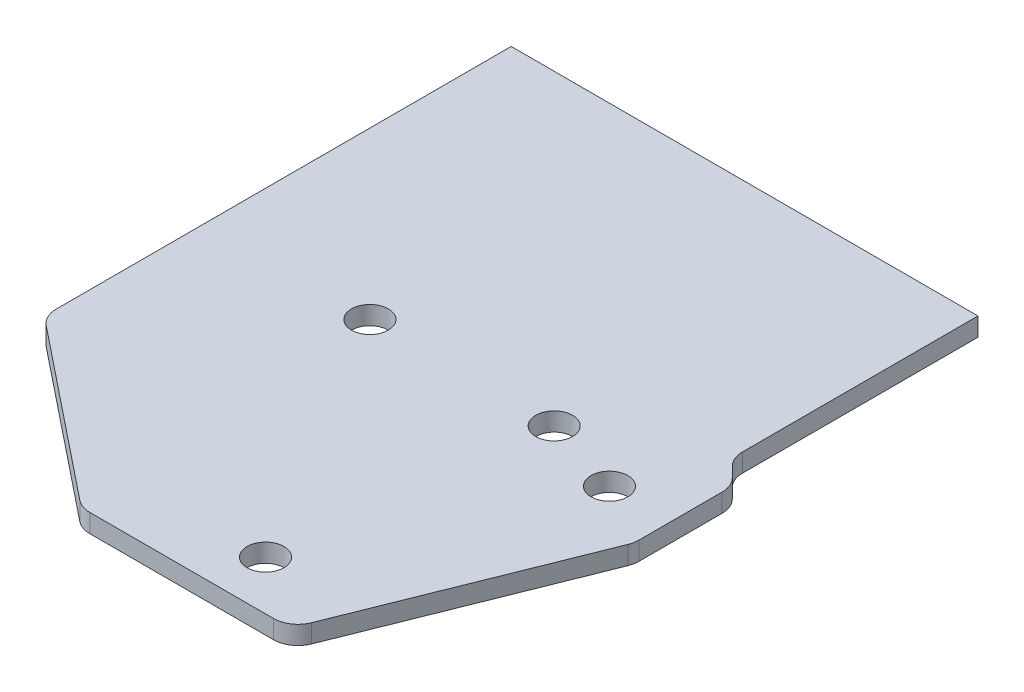
ISO-10303-21;
HEADER;
FILE_DESCRIPTION(('STEP AP214'),'2;1');
FILE_NAME('part.step','',(''),(''),'','','');
FILE_SCHEMA(('AUTOMOTIVE_DESIGN { 1 0 10303 214 1 1 1 1 }'));
ENDSEC;
DATA;
#1=APPLICATION_CONTEXT('core data for automotive mechanical design processes');
#2=APPLICATION_PROTOCOL_DEFINITION('international standard','automotive_design',2000,#1);
#3=PRODUCT_CONTEXT('',#1,'mechanical');
#4=PRODUCT('Part','Part','',(#3));
#5=PRODUCT_RELATED_PRODUCT_CATEGORY('part','',(#4));
#6=PRODUCT_DEFINITION_FORMATION('','',#4);
#7=PRODUCT_DEFINITION_CONTEXT('part definition',#1,'design');
#8=PRODUCT_DEFINITION('design','',#6,#7);
#9=PRODUCT_DEFINITION_SHAPE('','',#8);
#10=(LENGTH_UNIT() NAMED_UNIT(*) SI_UNIT(.MILLI.,.METRE.));
#11=(NAMED_UNIT(*) PLANE_ANGLE_UNIT() SI_UNIT($,.RADIAN.));
#12=(NAMED_UNIT(*) SI_UNIT($,.STERADIAN.) SOLID_ANGLE_UNIT());
#13=UNCERTAINTY_MEASURE_WITH_UNIT(LENGTH_MEASURE(1.E-05),#10,'distance_accuracy_value','');
#14=(GEOMETRIC_REPRESENTATION_CONTEXT(3) GLOBAL_UNCERTAINTY_ASSIGNED_CONTEXT((#13)) GLOBAL_UNIT_ASSIGNED_CONTEXT((#10,
#11,#12)) REPRESENTATION_CONTEXT('',''));
#15=CARTESIAN_POINT('',(0.,0.,0.));
#16=DIRECTION('',(0.,0.,1.));
#17=DIRECTION('',(1.,0.,0.));
#18=AXIS2_PLACEMENT_3D('',#15,#16,#17);
#19=CARTESIAN_POINT('',(19.,1.5,-2.17157287525381));
#20=DIRECTION('',(0.,-1.,0.));
#21=DIRECTION('',(0.,0.,-1.));
#22=AXIS2_PLACEMENT_3D('',#19,#20,#21);
#23=CYLINDRICAL_SURFACE('',#22,2.);
#24=CARTESIAN_POINT('',(19.,0.,-2.17157287525381));
#25=DIRECTION('',(0.,1.,0.));
#26=DIRECTION('',(0.,0.,1.));
#27=AXIS2_PLACEMENT_3D('',#24,#25,#26);
#28=CIRCLE('',#27,2.);
#29=CARTESIAN_POINT('',(20.4142135623731,0.,-3.5857864376269));
#30=VERTEX_POINT('',#29);
#31=CARTESIAN_POINT('',(21.,0.,-2.1715728752538));
#32=VERTEX_POINT('',#31);
#33=EDGE_CURVE('E176',#30,#32,#28,.F.);
#34=ORIENTED_EDGE('',*,*,#33,.F.);
#35=DIRECTION('',(0.,-1.,0.));
#36=VECTOR('',#35,1.);
#37=CARTESIAN_POINT('',(20.4142135623731,1.5,-3.5857864376269));
#38=LINE('',#37,#36);
#39=CARTESIAN_POINT('',(20.4142135623731,1.5,-3.5857864376269));
#40=VERTEX_POINT('',#39);
#41=EDGE_CURVE('E11',#40,#30,#38,.T.);
#42=ORIENTED_EDGE('',*,*,#41,.F.);
#43=CARTESIAN_POINT('',(19.,1.5,-2.17157287525381));
#44=DIRECTION('',(0.,1.,0.));
#45=DIRECTION('',(0.,0.,1.));
#46=AXIS2_PLACEMENT_3D('',#43,#44,#45);
#47=CIRCLE('',#46,2.);
#48=CARTESIAN_POINT('',(21.,1.5,-2.1715728752538));
#49=VERTEX_POINT('',#48);
#50=EDGE_CURVE('E223',#40,#49,#47,.F.);
#51=ORIENTED_EDGE('',*,*,#50,.T.);
#52=DIRECTION('',(0.,-1.,0.));
#53=VECTOR('',#52,1.);
#54=CARTESIAN_POINT('',(21.,1.5,-2.1715728752538));
#55=LINE('',#54,#53);
#56=EDGE_CURVE('E50',#49,#32,#55,.T.);
#57=ORIENTED_EDGE('',*,*,#56,.T.);
#58=EDGE_LOOP('',(#34,#42,#51,#57));
#59=FACE_BOUND('',#58,.T.);
#60=ADVANCED_FACE('F34',(#59),#23,.T.);
#61=CARTESIAN_POINT('',(11.9999999999999,1.5,-12.));
#62=DIRECTION('',(-0.707106781186545,0.,0.70710678118655));
#63=DIRECTION('',(0.70710678118655,0.,0.707106781186545));
#64=AXIS2_PLACEMENT_3D('',#61,#62,#63);
#65=PLANE('',#64);
#66=DIRECTION('',(-0.70710678118655,0.,-0.707106781186545));
#67=VECTOR('',#66,1.);
#68=CARTESIAN_POINT('',(11.9999999999999,0.,-12.));
#69=LINE('',#68,#67);
#70=CARTESIAN_POINT('',(19.5857864376269,0.,-4.41421356237308));
#71=VERTEX_POINT('',#70);
#72=EDGE_CURVE('E178',#30,#71,#69,.T.);
#73=ORIENTED_EDGE('',*,*,#72,.T.);
#74=DIRECTION('',(0.,-1.,0.));
#75=VECTOR('',#74,1.);
#76=CARTESIAN_POINT('',(19.5857864376269,1.5,-4.41421356237308));
#77=LINE('',#76,#75);
#78=CARTESIAN_POINT('',(19.5857864376269,1.5,-4.41421356237308));
#79=VERTEX_POINT('',#78);
#80=EDGE_CURVE('E42',#79,#71,#77,.T.);
#81=ORIENTED_EDGE('',*,*,#80,.F.);
#82=DIRECTION('',(-0.70710678118655,0.,-0.707106781186545));
#83=VECTOR('',#82,1.);
#84=CARTESIAN_POINT('',(11.9999999999999,1.5,-12.));
#85=LINE('',#84,#83);
#86=EDGE_CURVE('E269',#40,#79,#85,.T.);
#87=ORIENTED_EDGE('',*,*,#86,.F.);
#88=ORIENTED_EDGE('',*,*,#41,.T.);
#89=EDGE_LOOP('',(#73,#81,#87,#88));
#90=FACE_BOUND('',#89,.T.);
#91=ADVANCED_FACE('F254',(#90),#65,.F.);
#92=CARTESIAN_POINT('',(21.,1.5,-5.82842712474618));
#93=DIRECTION('',(0.,-1.,0.));
#94=DIRECTION('',(0.,0.,-1.));
#95=AXIS2_PLACEMENT_3D('',#92,#93,#94);
#96=CYLINDRICAL_SURFACE('',#95,1.99999999999999);
#97=CARTESIAN_POINT('',(21.,0.,-5.82842712474618));
#98=DIRECTION('',(0.,1.,0.));
#99=DIRECTION('',(0.,0.,1.));
#100=AXIS2_PLACEMENT_3D('',#97,#98,#99);
#101=CIRCLE('',#100,1.99999999999999);
#102=CARTESIAN_POINT('',(19.,0.,-5.82842712474618));
#103=VERTEX_POINT('',#102);
#104=EDGE_CURVE('E181',#103,#71,#101,.T.);
#105=ORIENTED_EDGE('',*,*,#104,.F.);
#106=DIRECTION('',(0.,-1.,0.));
#107=VECTOR('',#106,1.);
#108=CARTESIAN_POINT('',(19.,1.5,-5.82842712474618));
#109=LINE('',#108,#107);
#110=CARTESIAN_POINT('',(19.,1.5,-5.82842712474618));
#111=VERTEX_POINT('',#110);
#112=EDGE_CURVE('E244',#111,#103,#109,.T.);
#113=ORIENTED_EDGE('',*,*,#112,.F.);
#114=CARTESIAN_POINT('',(21.,1.5,-5.82842712474618));
#115=DIRECTION('',(0.,1.,0.));
#116=DIRECTION('',(0.,0.,1.));
#117=AXIS2_PLACEMENT_3D('',#114,#115,#116);
#118=CIRCLE('',#117,1.99999999999999);
#119=EDGE_CURVE('E251',#111,#79,#118,.T.);
#120=ORIENTED_EDGE('',*,*,#119,.T.);
#121=ORIENTED_EDGE('',*,*,#80,.T.);
#122=EDGE_LOOP('',(#105,#113,#120,#121));
#123=FACE_BOUND('',#122,.T.);
#124=ADVANCED_FACE('F249',(#123),#96,.F.);
#125=CARTESIAN_POINT('',(19.,1.5,0.));
#126=DIRECTION('',(-1.,0.,0.));
#127=DIRECTION('',(0.,0.,1.));
#128=AXIS2_PLACEMENT_3D('',#125,#126,#127);
#129=PLANE('',#128);
#130=DIRECTION('',(0.,0.,-1.));
#131=VECTOR('',#130,1.);
#132=CARTESIAN_POINT('',(19.,0.,0.));
#133=LINE('',#132,#131);
#134=CARTESIAN_POINT('',(19.,0.,-25.));
#135=VERTEX_POINT('',#134);
#136=EDGE_CURVE('E184',#103,#135,#133,.T.);
#137=ORIENTED_EDGE('',*,*,#136,.T.);
#138=DIRECTION('',(0.,-1.,0.));
#139=VECTOR('',#138,1.);
#140=CARTESIAN_POINT('',(19.,1.5,-25.));
#141=LINE('',#140,#139);
#142=CARTESIAN_POINT('',(19.,1.5,-25.));
#143=VERTEX_POINT('',#142);
#144=EDGE_CURVE('E242',#143,#135,#141,.T.);
#145=ORIENTED_EDGE('',*,*,#144,.F.);
#146=DIRECTION('',(0.,0.,-1.));
#147=VECTOR('',#146,1.);
#148=CARTESIAN_POINT('',(19.,1.5,0.));
#149=LINE('',#148,#147);
#150=EDGE_CURVE('E265',#111,#143,#149,.T.);
#151=ORIENTED_EDGE('',*,*,#150,.F.);
#152=ORIENTED_EDGE('',*,*,#112,.T.);
#153=EDGE_LOOP('',(#137,#145,#151,#152));
#154=FACE_BOUND('',#153,.T.);
#155=ADVANCED_FACE('F262',(#154),#129,.F.);
#156=CARTESIAN_POINT('',(0.,1.5,-25.));
#157=DIRECTION('',(0.,0.,-1.));
#158=DIRECTION('',(-1.,0.,0.));
#159=AXIS2_PLACEMENT_3D('',#156,#157,#158);
#160=PLANE('',#159);
#161=DIRECTION('',(1.,0.,0.));
#162=VECTOR('',#161,1.);
#163=CARTESIAN_POINT('',(0.,0.,-25.));
#164=LINE('',#163,#162);
#165=CARTESIAN_POINT('',(-19.,0.,-25.));
#166=VERTEX_POINT('',#165);
#167=EDGE_CURVE('E187',#166,#135,#164,.T.);
#168=ORIENTED_EDGE('',*,*,#167,.F.);
#169=DIRECTION('',(0.,-1.,0.));
#170=VECTOR('',#169,1.);
#171=CARTESIAN_POINT('',(-19.,1.5,-25.));
#172=LINE('',#171,#170);
#173=CARTESIAN_POINT('',(-19.,1.5,-25.));
#174=VERTEX_POINT('',#173);
#175=EDGE_CURVE('E240',#174,#166,#172,.T.);
#176=ORIENTED_EDGE('',*,*,#175,.F.);
#177=DIRECTION('',(1.,0.,0.));
#178=VECTOR('',#177,1.);
#179=CARTESIAN_POINT('',(0.,1.5,-25.));
#180=LINE('',#179,#178);
#181=EDGE_CURVE('E267',#174,#143,#180,.T.);
#182=ORIENTED_EDGE('',*,*,#181,.T.);
#183=ORIENTED_EDGE('',*,*,#144,.T.);
#184=EDGE_LOOP('',(#168,#176,#182,#183));
#185=FACE_BOUND('',#184,.T.);
#186=ADVANCED_FACE('F316',(#185),#160,.T.);
#187=CARTESIAN_POINT('',(-19.,1.5,0.));
#188=DIRECTION('',(-1.,0.,0.));
#189=DIRECTION('',(0.,0.,1.));
#190=AXIS2_PLACEMENT_3D('',#187,#188,#189);
#191=PLANE('',#190);
#192=DIRECTION('',(0.,0.,-1.));
#193=VECTOR('',#192,1.);
#194=CARTESIAN_POINT('',(-19.,0.,0.));
#195=LINE('',#194,#193);
#196=CARTESIAN_POINT('',(-19.,0.,12.0387503050268));
#197=VERTEX_POINT('',#196);
#198=EDGE_CURVE('E190',#197,#166,#195,.T.);
#199=ORIENTED_EDGE('',*,*,#198,.F.);
#200=DIRECTION('',(0.,-1.,0.));
#201=VECTOR('',#200,1.);
#202=CARTESIAN_POINT('',(-19.,1.5,12.0387503050268));
#203=LINE('',#202,#201);
#204=CARTESIAN_POINT('',(-19.,1.5,12.0387503050268));
#205=VERTEX_POINT('',#204);
#206=EDGE_CURVE('E238',#205,#197,#203,.T.);
#207=ORIENTED_EDGE('',*,*,#206,.F.);
#208=DIRECTION('',(0.,0.,-1.));
#209=VECTOR('',#208,1.);
#210=CARTESIAN_POINT('',(-19.,1.5,0.));
#211=LINE('',#210,#209);
#212=EDGE_CURVE('E275',#205,#174,#211,.T.);
#213=ORIENTED_EDGE('',*,*,#212,.T.);
#214=ORIENTED_EDGE('',*,*,#175,.T.);
#215=EDGE_LOOP('',(#199,#207,#213,#214));
#216=FACE_BOUND('',#215,.T.);
#217=ADVANCED_FACE('F319',(#216),#191,.T.);
#218=CARTESIAN_POINT('',(-17.,1.5,12.0387503050269));
#219=DIRECTION('',(0.,-1.,0.));
#220=DIRECTION('',(0.,0.,-1.));
#221=AXIS2_PLACEMENT_3D('',#218,#219,#220);
#222=CYLINDRICAL_SURFACE('',#221,2.);
#223=CARTESIAN_POINT('',(-17.,0.,12.0387503050269));
#224=DIRECTION('',(0.,1.,0.));
#225=DIRECTION('',(0.,0.,1.));
#226=AXIS2_PLACEMENT_3D('',#223,#224,#225);
#227=CIRCLE('',#226,2.);
#228=CARTESIAN_POINT('',(-18.2493900951088,0.,13.6004879239129));
#229=VERTEX_POINT('',#228);
#230=EDGE_CURVE('E193',#197,#229,#227,.T.);
#231=ORIENTED_EDGE('',*,*,#230,.T.);
#232=DIRECTION('',(0.,-1.,0.));
#233=VECTOR('',#232,1.);
#234=CARTESIAN_POINT('',(-18.2493900951088,1.5,13.6004879239129));
#235=LINE('',#234,#233);
#236=CARTESIAN_POINT('',(-18.2493900951088,1.5,13.6004879239129));
#237=VERTEX_POINT('',#236);
#238=EDGE_CURVE('E235',#237,#229,#235,.T.);
#239=ORIENTED_EDGE('',*,*,#238,.F.);
#240=CARTESIAN_POINT('',(-17.,1.5,12.0387503050269));
#241=DIRECTION('',(0.,1.,0.));
#242=DIRECTION('',(0.,0.,1.));
#243=AXIS2_PLACEMENT_3D('',#240,#241,#242);
#244=CIRCLE('',#243,2.);
#245=EDGE_CURVE('E278',#205,#237,#244,.T.);
#246=ORIENTED_EDGE('',*,*,#245,.F.);
#247=ORIENTED_EDGE('',*,*,#206,.T.);
#248=EDGE_LOOP('',(#231,#239,#246,#247));
#249=FACE_BOUND('',#248,.T.);
#250=ADVANCED_FACE('F323',(#249),#222,.T.);
#251=CARTESIAN_POINT('',(-13.7560975609756,1.5,17.1951219512195));
#252=DIRECTION('',(0.624695047554425,0.,-0.78086880944303));
#253=DIRECTION('',(-0.78086880944303,0.,-0.624695047554425));
#254=AXIS2_PLACEMENT_3D('',#251,#252,#253);
#255=PLANE('',#254);
#256=DIRECTION('',(0.78086880944303,0.,0.624695047554425));
#257=VECTOR('',#256,1.);
#258=CARTESIAN_POINT('',(-13.7560975609756,0.,17.1951219512195));
#259=LINE('',#258,#257);
#260=CARTESIAN_POINT('',(-4.54782797639243,0.,24.5617376188861));
#261=VERTEX_POINT('',#260);
#262=EDGE_CURVE('E195',#229,#261,#259,.T.);
#263=ORIENTED_EDGE('',*,*,#262,.T.);
#264=DIRECTION('',(0.,-1.,0.));
#265=VECTOR('',#264,1.);
#266=CARTESIAN_POINT('',(-4.54782797639243,1.5,24.5617376188861));
#267=LINE('',#266,#265);
#268=CARTESIAN_POINT('',(-4.54782797639243,1.5,24.5617376188861));
#269=VERTEX_POINT('',#268);
#270=EDGE_CURVE('E232',#269,#261,#267,.T.);
#271=ORIENTED_EDGE('',*,*,#270,.F.);
#272=DIRECTION('',(0.78086880944303,0.,0.624695047554425));
#273=VECTOR('',#272,1.);
#274=CARTESIAN_POINT('',(-13.7560975609756,1.5,17.1951219512195));
#275=LINE('',#274,#273);
#276=EDGE_CURVE('E280',#237,#269,#275,.T.);
#277=ORIENTED_EDGE('',*,*,#276,.F.);
#278=ORIENTED_EDGE('',*,*,#238,.T.);
#279=EDGE_LOOP('',(#263,#271,#277,#278));
#280=FACE_BOUND('',#279,.T.);
#281=ADVANCED_FACE('F327',(#280),#255,.F.);
#282=CARTESIAN_POINT('',(-3.29843788128358,1.5,23.));
#283=DIRECTION('',(0.,-1.,0.));
#284=DIRECTION('',(0.,0.,-1.));
#285=AXIS2_PLACEMENT_3D('',#282,#283,#284);
#286=CYLINDRICAL_SURFACE('',#285,2.);
#287=CARTESIAN_POINT('',(-3.29843788128358,0.,23.));
#288=DIRECTION('',(0.,1.,0.));
#289=DIRECTION('',(0.,0.,1.));
#290=AXIS2_PLACEMENT_3D('',#287,#288,#289);
#291=CIRCLE('',#290,2.);
#292=CARTESIAN_POINT('',(-3.29843788128357,0.,25.));
#293=VERTEX_POINT('',#292);
#294=EDGE_CURVE('E197',#261,#293,#291,.T.);
#295=ORIENTED_EDGE('',*,*,#294,.T.);
#296=DIRECTION('',(0.,-1.,0.));
#297=VECTOR('',#296,1.);
#298=CARTESIAN_POINT('',(-3.29843788128357,1.5,25.));
#299=LINE('',#298,#297);
#300=CARTESIAN_POINT('',(-3.29843788128357,1.5,25.));
#301=VERTEX_POINT('',#300);
#302=EDGE_CURVE('E229',#301,#293,#299,.T.);
#303=ORIENTED_EDGE('',*,*,#302,.F.);
#304=CARTESIAN_POINT('',(-3.29843788128358,1.5,23.));
#305=DIRECTION('',(0.,1.,0.));
#306=DIRECTION('',(0.,0.,1.));
#307=AXIS2_PLACEMENT_3D('',#304,#305,#306);
#308=CIRCLE('',#307,2.);
#309=EDGE_CURVE('E282',#269,#301,#308,.T.);
#310=ORIENTED_EDGE('',*,*,#309,.F.);
#311=ORIENTED_EDGE('',*,*,#270,.T.);
#312=EDGE_LOOP('',(#295,#303,#310,#311));
#313=FACE_BOUND('',#312,.T.);
#314=ADVANCED_FACE('F331',(#313),#286,.T.);
#315=CARTESIAN_POINT('',(0.,1.5,25.));
#316=DIRECTION('',(0.,0.,-1.));
#317=DIRECTION('',(-1.,0.,0.));
#318=AXIS2_PLACEMENT_3D('',#315,#316,#317);
#319=PLANE('',#318);
#320=DIRECTION('',(1.,0.,0.));
#321=VECTOR('',#320,1.);
#322=CARTESIAN_POINT('',(0.,0.,25.));
#323=LINE('',#322,#321);
#324=CARTESIAN_POINT('',(11.6459340771462,0.,25.));
#325=VERTEX_POINT('',#324);
#326=EDGE_CURVE('E199',#293,#325,#323,.T.);
#327=ORIENTED_EDGE('',*,*,#326,.T.);
#328=DIRECTION('',(0.,-1.,0.));
#329=VECTOR('',#328,1.);
#330=CARTESIAN_POINT('',(11.6459340771462,1.5,25.));
#331=LINE('',#330,#329);
#332=CARTESIAN_POINT('',(11.6459340771462,1.5,25.));
#333=VERTEX_POINT('',#332);
#334=EDGE_CURVE('E227',#333,#325,#331,.T.);
#335=ORIENTED_EDGE('',*,*,#334,.F.);
#336=DIRECTION('',(1.,0.,0.));
#337=VECTOR('',#336,1.);
#338=CARTESIAN_POINT('',(0.,1.5,25.));
#339=LINE('',#338,#337);
#340=EDGE_CURVE('E284',#301,#333,#339,.T.);
#341=ORIENTED_EDGE('',*,*,#340,.F.);
#342=ORIENTED_EDGE('',*,*,#302,.T.);
#343=EDGE_LOOP('',(#327,#335,#341,#342));
#344=FACE_BOUND('',#343,.T.);
#345=ADVANCED_FACE('F335',(#344),#319,.F.);
#346=CARTESIAN_POINT('',(11.6459340771462,1.5,23.));
#347=DIRECTION('',(0.,-1.,0.));
#348=DIRECTION('',(0.,0.,-1.));
#349=AXIS2_PLACEMENT_3D('',#346,#347,#348);
#350=CYLINDRICAL_SURFACE('',#349,2.);
#351=CARTESIAN_POINT('',(11.6459340771462,0.,23.));
#352=DIRECTION('',(0.,1.,0.));
#353=DIRECTION('',(0.,0.,1.));
#354=AXIS2_PLACEMENT_3D('',#351,#352,#353);
#355=CIRCLE('',#354,2.);
#356=CARTESIAN_POINT('',(13.5028874589167,0.,23.7427813527082));
#357=VERTEX_POINT('',#356);
#358=EDGE_CURVE('E202',#357,#325,#355,.F.);
#359=ORIENTED_EDGE('',*,*,#358,.F.);
#360=DIRECTION('',(0.,-1.,0.));
#361=VECTOR('',#360,1.);
#362=CARTESIAN_POINT('',(13.5028874589167,1.5,23.7427813527082));
#363=LINE('',#362,#361);
#364=CARTESIAN_POINT('',(13.5028874589167,1.5,23.7427813527082));
#365=VERTEX_POINT('',#364);
#366=EDGE_CURVE('E156',#365,#357,#363,.T.);
#367=ORIENTED_EDGE('',*,*,#366,.F.);
#368=CARTESIAN_POINT('',(11.6459340771462,1.5,23.));
#369=DIRECTION('',(0.,1.,0.));
#370=DIRECTION('',(0.,0.,1.));
#371=AXIS2_PLACEMENT_3D('',#368,#369,#370);
#372=CIRCLE('',#371,2.);
#373=EDGE_CURVE('E146',#365,#333,#372,.F.);
#374=ORIENTED_EDGE('',*,*,#373,.T.);
#375=ORIENTED_EDGE('',*,*,#334,.T.);
#376=EDGE_LOOP('',(#359,#367,#374,#375));
#377=FACE_BOUND('',#376,.T.);
#378=ADVANCED_FACE('F287',(#377),#350,.T.);
#379=CARTESIAN_POINT('',(19.8275862068966,1.5,7.93103448275862));
#380=DIRECTION('',(-0.928476690885259,0.,-0.371390676354103));
#381=DIRECTION('',(-0.371390676354104,0.,0.928476690885259));
#382=AXIS2_PLACEMENT_3D('',#379,#380,#381);
#383=PLANE('',#382);
#384=DIRECTION('',(0.371390676354104,0.,-0.928476690885259));
#385=VECTOR('',#384,1.);
#386=CARTESIAN_POINT('',(19.8275862068966,0.,7.93103448275862));
#387=LINE('',#386,#385);
#388=CARTESIAN_POINT('',(20.8569533817705,0.,5.35761654557371));
#389=VERTEX_POINT('',#388);
#390=EDGE_CURVE('E153',#357,#389,#387,.T.);
#391=ORIENTED_EDGE('',*,*,#390,.T.);
#392=DIRECTION('',(0.,-1.,0.));
#393=VECTOR('',#392,1.);
#394=CARTESIAN_POINT('',(20.8569533817705,1.5,5.35761654557371));
#395=LINE('',#394,#393);
#396=CARTESIAN_POINT('',(20.8569533817705,1.5,5.35761654557371));
#397=VERTEX_POINT('',#396);
#398=EDGE_CURVE('E150',#397,#389,#395,.T.);
#399=ORIENTED_EDGE('',*,*,#398,.F.);
#400=DIRECTION('',(0.371390676354104,0.,-0.928476690885259));
#401=VECTOR('',#400,1.);
#402=CARTESIAN_POINT('',(19.8275862068966,1.5,7.93103448275862));
#403=LINE('',#402,#401);
#404=EDGE_CURVE('E137',#365,#397,#403,.T.);
#405=ORIENTED_EDGE('',*,*,#404,.F.);
#406=ORIENTED_EDGE('',*,*,#366,.T.);
#407=EDGE_LOOP('',(#391,#399,#405,#406));
#408=FACE_BOUND('',#407,.T.);
#409=ADVANCED_FACE('F151',(#408),#383,.F.);
#410=CARTESIAN_POINT('',(19.,1.5,4.6148351928655));
#411=DIRECTION('',(0.,-1.,0.));
#412=DIRECTION('',(0.,0.,-1.));
#413=AXIS2_PLACEMENT_3D('',#410,#411,#412);
#414=CYLINDRICAL_SURFACE('',#413,2.);
#415=CARTESIAN_POINT('',(19.,0.,4.6148351928655));
#416=DIRECTION('',(0.,1.,0.));
#417=DIRECTION('',(0.,0.,1.));
#418=AXIS2_PLACEMENT_3D('',#415,#416,#417);
#419=CIRCLE('',#418,2.);
#420=CARTESIAN_POINT('',(21.,0.,4.61483519286549));
#421=VERTEX_POINT('',#420);
#422=EDGE_CURVE('E206',#389,#421,#419,.T.);
#423=ORIENTED_EDGE('',*,*,#422,.T.);
#424=DIRECTION('',(0.,-1.,0.));
#425=VECTOR('',#424,1.);
#426=CARTESIAN_POINT('',(21.,1.5,4.61483519286549));
#427=LINE('',#426,#425);
#428=CARTESIAN_POINT('',(21.,1.5,4.61483519286549));
#429=VERTEX_POINT('',#428);
#430=EDGE_CURVE('E94',#429,#421,#427,.T.);
#431=ORIENTED_EDGE('',*,*,#430,.F.);
#432=CARTESIAN_POINT('',(19.,1.5,4.6148351928655));
#433=DIRECTION('',(0.,1.,0.));
#434=DIRECTION('',(0.,0.,1.));
#435=AXIS2_PLACEMENT_3D('',#432,#433,#434);
#436=CIRCLE('',#435,2.);
#437=EDGE_CURVE('E144',#397,#429,#436,.T.);
#438=ORIENTED_EDGE('',*,*,#437,.F.);
#439=ORIENTED_EDGE('',*,*,#398,.T.);
#440=EDGE_LOOP('',(#423,#431,#438,#439));
#441=FACE_BOUND('',#440,.T.);
#442=ADVANCED_FACE('F158',(#441),#414,.T.);
#443=CARTESIAN_POINT('',(9.5,1.5,0.));
#444=DIRECTION('',(0.,-1.,0.));
#445=DIRECTION('',(0.,0.,-1.));
#446=AXIS2_PLACEMENT_3D('',#443,#444,#445);
#447=CYLINDRICAL_SURFACE('',#446,1.5);
#448=CARTESIAN_POINT('',(9.5,1.5,0.));
#449=DIRECTION('',(0.,1.,0.));
#450=DIRECTION('',(0.,0.,1.));
#451=AXIS2_PLACEMENT_3D('',#448,#449,#450);
#452=CIRCLE('',#451,1.5);
#453=CARTESIAN_POINT('',(9.5,1.5,1.50000000000001));
#454=VERTEX_POINT('',#453);
#455=EDGE_CURVE('E170',#454,#454,#452,.T.);
#456=ORIENTED_EDGE('',*,*,#455,.T.);
#457=EDGE_LOOP('',(#456));
#458=FACE_BOUND('',#457,.T.);
#459=CARTESIAN_POINT('',(9.5,0.,0.));
#460=DIRECTION('',(0.,1.,0.));
#461=DIRECTION('',(0.,0.,1.));
#462=AXIS2_PLACEMENT_3D('',#459,#460,#461);
#463=CIRCLE('',#462,1.5);
#464=CARTESIAN_POINT('',(9.5,0.,1.50000000000001));
#465=VERTEX_POINT('',#464);
#466=EDGE_CURVE('E217',#465,#465,#463,.T.);
#467=ORIENTED_EDGE('',*,*,#466,.F.);
#468=EDGE_LOOP('',(#467));
#469=FACE_BOUND('',#468,.T.);
#470=ADVANCED_FACE('F344',(#458,#469),#447,.F.);
#471=CARTESIAN_POINT('',(-5.5,1.5,0.));
#472=DIRECTION('',(0.,-1.,0.));
#473=DIRECTION('',(0.,0.,-1.));
#474=AXIS2_PLACEMENT_3D('',#471,#472,#473);
#475=CYLINDRICAL_SURFACE('',#474,1.5);
#476=CARTESIAN_POINT('',(-5.5,1.5,0.));
#477=DIRECTION('',(0.,1.,0.));
#478=DIRECTION('',(0.,0.,1.));
#479=AXIS2_PLACEMENT_3D('',#476,#477,#478);
#480=CIRCLE('',#479,1.5);
#481=CARTESIAN_POINT('',(-5.5,1.5,1.49999999999999));
#482=VERTEX_POINT('',#481);
#483=EDGE_CURVE('E167',#482,#482,#480,.T.);
#484=ORIENTED_EDGE('',*,*,#483,.T.);
#485=EDGE_LOOP('',(#484));
#486=FACE_BOUND('',#485,.T.);
#487=CARTESIAN_POINT('',(-5.5,0.,0.));
#488=DIRECTION('',(0.,1.,0.));
#489=DIRECTION('',(0.,0.,1.));
#490=AXIS2_PLACEMENT_3D('',#487,#488,#489);
#491=CIRCLE('',#490,1.5);
#492=CARTESIAN_POINT('',(-5.5,0.,1.49999999999999));
#493=VERTEX_POINT('',#492);
#494=EDGE_CURVE('E214',#493,#493,#491,.T.);
#495=ORIENTED_EDGE('',*,*,#494,.F.);
#496=EDGE_LOOP('',(#495));
#497=FACE_BOUND('',#496,.T.);
#498=ADVANCED_FACE('F301',(#486,#497),#475,.F.);
#499=CARTESIAN_POINT('',(7.,1.5,21.));
#500=DIRECTION('',(0.,-1.,0.));
#501=DIRECTION('',(0.,0.,-1.));
#502=AXIS2_PLACEMENT_3D('',#499,#500,#501);
#503=CYLINDRICAL_SURFACE('',#502,1.5);
#504=CARTESIAN_POINT('',(7.,1.5,21.));
#505=DIRECTION('',(0.,1.,0.));
#506=DIRECTION('',(0.,0.,1.));
#507=AXIS2_PLACEMENT_3D('',#504,#505,#506);
#508=CIRCLE('',#507,1.5);
#509=CARTESIAN_POINT('',(7.,1.5,22.5));
#510=VERTEX_POINT('',#509);
#511=EDGE_CURVE('E161',#510,#510,#508,.T.);
#512=ORIENTED_EDGE('',*,*,#511,.T.);
#513=EDGE_LOOP('',(#512));
#514=FACE_BOUND('',#513,.T.);
#515=CARTESIAN_POINT('',(7.,0.,21.));
#516=DIRECTION('',(0.,1.,0.));
#517=DIRECTION('',(0.,0.,1.));
#518=AXIS2_PLACEMENT_3D('',#515,#516,#517);
#519=CIRCLE('',#518,1.5);
#520=CARTESIAN_POINT('',(7.,0.,22.5));
#521=VERTEX_POINT('',#520);
#522=EDGE_CURVE('E211',#521,#521,#519,.T.);
#523=ORIENTED_EDGE('',*,*,#522,.F.);
#524=EDGE_LOOP('',(#523));
#525=FACE_BOUND('',#524,.T.);
#526=ADVANCED_FACE('F293',(#514,#525),#503,.F.);
#527=CARTESIAN_POINT('',(21.,1.5,0.));
#528=DIRECTION('',(1.,0.,0.));
#529=DIRECTION('',(0.,0.,-1.));
#530=AXIS2_PLACEMENT_3D('',#527,#528,#529);
#531=PLANE('',#530);
#532=DIRECTION('',(0.,0.,1.));
#533=VECTOR('',#532,1.);
#534=CARTESIAN_POINT('',(21.,0.,0.));
#535=LINE('',#534,#533);
#536=EDGE_CURVE('E208',#32,#421,#535,.T.);
#537=ORIENTED_EDGE('',*,*,#536,.F.);
#538=ORIENTED_EDGE('',*,*,#56,.F.);
#539=DIRECTION('',(0.,0.,1.));
#540=VECTOR('',#539,1.);
#541=CARTESIAN_POINT('',(21.,1.5,0.));
#542=LINE('',#541,#540);
#543=EDGE_CURVE('E159',#49,#429,#542,.T.);
#544=ORIENTED_EDGE('',*,*,#543,.T.);
#545=ORIENTED_EDGE('',*,*,#430,.T.);
#546=EDGE_LOOP('',(#537,#538,#544,#545));
#547=FACE_BOUND('',#546,.T.);
#548=ADVANCED_FACE('F290',(#547),#531,.T.);
#549=CARTESIAN_POINT('',(16.,1.5,2.));
#550=DIRECTION('',(0.,-1.,0.));
#551=DIRECTION('',(0.,0.,-1.));
#552=AXIS2_PLACEMENT_3D('',#549,#550,#551);
#553=CYLINDRICAL_SURFACE('',#552,1.5);
#554=CARTESIAN_POINT('',(16.,1.5,2.));
#555=DIRECTION('',(0.,1.,0.));
#556=DIRECTION('',(0.,0.,1.));
#557=AXIS2_PLACEMENT_3D('',#554,#555,#556);
#558=CIRCLE('',#557,1.5);
#559=CARTESIAN_POINT('',(16.,1.5,3.5));
#560=VERTEX_POINT('',#559);
#561=EDGE_CURVE('E173',#560,#560,#558,.T.);
#562=ORIENTED_EDGE('',*,*,#561,.T.);
#563=EDGE_LOOP('',(#562));
#564=FACE_BOUND('',#563,.T.);
#565=CARTESIAN_POINT('',(16.,0.,2.));
#566=DIRECTION('',(0.,1.,0.));
#567=DIRECTION('',(0.,0.,1.));
#568=AXIS2_PLACEMENT_3D('',#565,#566,#567);
#569=CIRCLE('',#568,1.5);
#570=CARTESIAN_POINT('',(16.,0.,3.5));
#571=VERTEX_POINT('',#570);
#572=EDGE_CURVE('E220',#571,#571,#569,.T.);
#573=ORIENTED_EDGE('',*,*,#572,.F.);
#574=EDGE_LOOP('',(#573));
#575=FACE_BOUND('',#574,.T.);
#576=ADVANCED_FACE('F292',(#564,#575),#553,.F.);
#577=CARTESIAN_POINT('',(0.,1.5,0.));
#578=DIRECTION('',(0.,1.,0.));
#579=DIRECTION('',(0.,0.,1.));
#580=AXIS2_PLACEMENT_3D('',#577,#578,#579);
#581=PLANE('',#580);
#582=ORIENTED_EDGE('',*,*,#50,.F.);
#583=ORIENTED_EDGE('',*,*,#86,.T.);
#584=ORIENTED_EDGE('',*,*,#119,.F.);
#585=ORIENTED_EDGE('',*,*,#150,.T.);
#586=ORIENTED_EDGE('',*,*,#181,.F.);
#587=ORIENTED_EDGE('',*,*,#212,.F.);
#588=ORIENTED_EDGE('',*,*,#245,.T.);
#589=ORIENTED_EDGE('',*,*,#276,.T.);
#590=ORIENTED_EDGE('',*,*,#309,.T.);
#591=ORIENTED_EDGE('',*,*,#340,.T.);
#592=ORIENTED_EDGE('',*,*,#373,.F.);
#593=ORIENTED_EDGE('',*,*,#404,.T.);
#594=ORIENTED_EDGE('',*,*,#437,.T.);
#595=ORIENTED_EDGE('',*,*,#543,.F.);
#596=EDGE_LOOP('',(#582,#583,#584,#585,#586,#587,#588,#589,#590,#591,#592,#593,#594,#595));
#597=FACE_BOUND('',#596,.T.);
#598=ORIENTED_EDGE('',*,*,#511,.F.);
#599=EDGE_LOOP('',(#598));
#600=FACE_BOUND('',#599,.T.);
#601=ORIENTED_EDGE('',*,*,#483,.F.);
#602=EDGE_LOOP('',(#601));
#603=FACE_BOUND('',#602,.T.);
#604=ORIENTED_EDGE('',*,*,#455,.F.);
#605=EDGE_LOOP('',(#604));
#606=FACE_BOUND('',#605,.T.);
#607=ORIENTED_EDGE('',*,*,#561,.F.);
#608=EDGE_LOOP('',(#607));
#609=FACE_BOUND('',#608,.T.);
#610=ADVANCED_FACE('F140',(#597,#600,#603,#606,#609),#581,.T.);
#611=CARTESIAN_POINT('',(0.,0.,0.));
#612=DIRECTION('',(0.,1.,0.));
#613=DIRECTION('',(0.,0.,1.));
#614=AXIS2_PLACEMENT_3D('',#611,#612,#613);
#615=PLANE('',#614);
#616=ORIENTED_EDGE('',*,*,#33,.T.);
#617=ORIENTED_EDGE('',*,*,#536,.T.);
#618=ORIENTED_EDGE('',*,*,#422,.F.);
#619=ORIENTED_EDGE('',*,*,#390,.F.);
#620=ORIENTED_EDGE('',*,*,#358,.T.);
#621=ORIENTED_EDGE('',*,*,#326,.F.);
#622=ORIENTED_EDGE('',*,*,#294,.F.);
#623=ORIENTED_EDGE('',*,*,#262,.F.);
#624=ORIENTED_EDGE('',*,*,#230,.F.);
#625=ORIENTED_EDGE('',*,*,#198,.T.);
#626=ORIENTED_EDGE('',*,*,#167,.T.);
#627=ORIENTED_EDGE('',*,*,#136,.F.);
#628=ORIENTED_EDGE('',*,*,#104,.T.);
#629=ORIENTED_EDGE('',*,*,#72,.F.);
#630=EDGE_LOOP('',(#616,#617,#618,#619,#620,#621,#622,#623,#624,#625,#626,#627,#628,#629));
#631=FACE_BOUND('',#630,.T.);
#632=ORIENTED_EDGE('',*,*,#522,.T.);
#633=EDGE_LOOP('',(#632));
#634=FACE_BOUND('',#633,.T.);
#635=ORIENTED_EDGE('',*,*,#494,.T.);
#636=EDGE_LOOP('',(#635));
#637=FACE_BOUND('',#636,.T.);
#638=ORIENTED_EDGE('',*,*,#466,.T.);
#639=EDGE_LOOP('',(#638));
#640=FACE_BOUND('',#639,.T.);
#641=ORIENTED_EDGE('',*,*,#572,.T.);
#642=EDGE_LOOP('',(#641));
#643=FACE_BOUND('',#642,.T.);
#644=ADVANCED_FACE('F257',(#631,#634,#637,#640,#643),#615,.F.);
#645=CLOSED_SHELL('',(#60,#91,#124,#155,#186,#217,#250,#281,#314,#345,#378,#409,#442,#470,#498,
#526,#548,#576,#610,#644));
#646=MANIFOLD_SOLID_BREP('B2',#645);
#647=ADVANCED_BREP_SHAPE_REPRESENTATION('',(#18,#646),#14);
#648=SHAPE_DEFINITION_REPRESENTATION(#9,#647);
ENDSEC;
END-ISO-10303-21;
